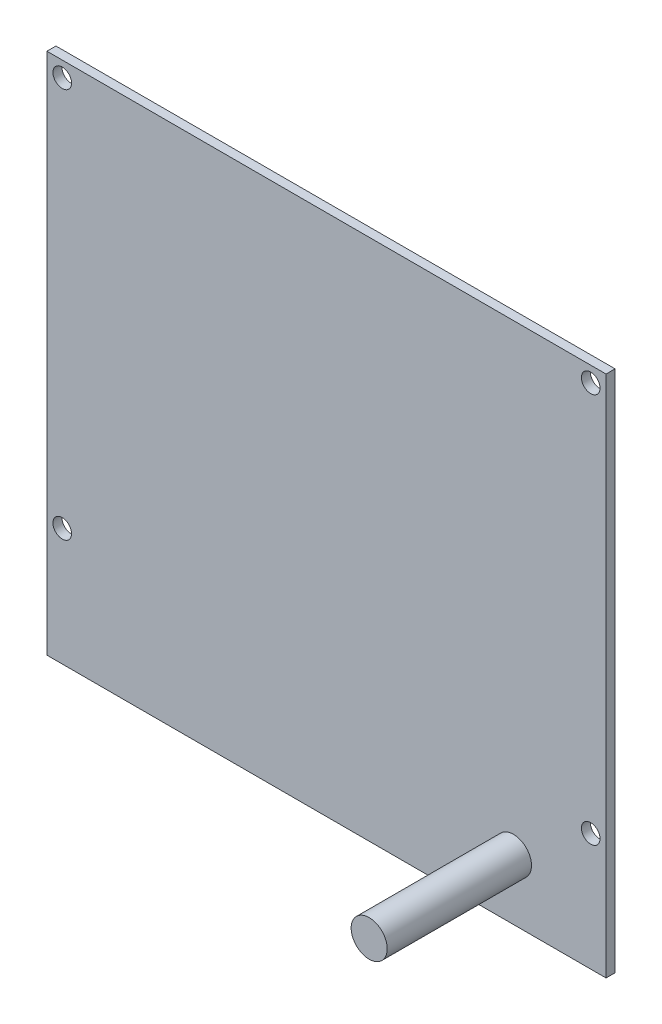
ISO-10303-21;
HEADER;
FILE_DESCRIPTION(('STEP AP214'),'2;1');
FILE_NAME('part.step','',(''),(''),'','','');
FILE_SCHEMA(('AUTOMOTIVE_DESIGN { 1 0 10303 214 1 1 1 1 }'));
ENDSEC;
DATA;
#1=APPLICATION_CONTEXT('core data for automotive mechanical design processes');
#2=APPLICATION_PROTOCOL_DEFINITION('international standard','automotive_design',2000,#1);
#3=PRODUCT_CONTEXT('',#1,'mechanical');
#4=PRODUCT('Part','Part','',(#3));
#5=PRODUCT_RELATED_PRODUCT_CATEGORY('part','',(#4));
#6=PRODUCT_DEFINITION_FORMATION('','',#4);
#7=PRODUCT_DEFINITION_CONTEXT('part definition',#1,'design');
#8=PRODUCT_DEFINITION('design','',#6,#7);
#9=PRODUCT_DEFINITION_SHAPE('','',#8);
#10=(LENGTH_UNIT() NAMED_UNIT(*) SI_UNIT(.MILLI.,.METRE.));
#11=(NAMED_UNIT(*) PLANE_ANGLE_UNIT() SI_UNIT($,.RADIAN.));
#12=(NAMED_UNIT(*) SI_UNIT($,.STERADIAN.) SOLID_ANGLE_UNIT());
#13=UNCERTAINTY_MEASURE_WITH_UNIT(LENGTH_MEASURE(1.E-05),#10,'distance_accuracy_value','');
#14=(GEOMETRIC_REPRESENTATION_CONTEXT(3) GLOBAL_UNCERTAINTY_ASSIGNED_CONTEXT((#13)) GLOBAL_UNIT_ASSIGNED_CONTEXT((#10,
#11,#12)) REPRESENTATION_CONTEXT('',''));
#15=CARTESIAN_POINT('',(0.,0.,0.));
#16=DIRECTION('',(0.,0.,1.));
#17=DIRECTION('',(1.,0.,0.));
#18=AXIS2_PLACEMENT_3D('',#15,#16,#17);
#19=CARTESIAN_POINT('',(46.5,-43.5,1.5));
#20=DIRECTION('',(0.,-1.,0.));
#21=DIRECTION('',(0.,0.,-1.));
#22=AXIS2_PLACEMENT_3D('',#19,#20,#21);
#23=PLANE('',#22);
#24=DIRECTION('',(-1.,0.,0.));
#25=VECTOR('',#24,1.);
#26=CARTESIAN_POINT('',(46.5,-43.5,0.));
#27=LINE('',#26,#25);
#28=CARTESIAN_POINT('',(46.5,-43.5,0.));
#29=VERTEX_POINT('',#28);
#30=CARTESIAN_POINT('',(-46.5,-43.5,0.));
#31=VERTEX_POINT('',#30);
#32=EDGE_CURVE('E105',#29,#31,#27,.T.);
#33=ORIENTED_EDGE('',*,*,#32,.F.);
#34=DIRECTION('',(0.,0.,-1.));
#35=VECTOR('',#34,1.);
#36=CARTESIAN_POINT('',(46.5,-43.5,1.5));
#37=LINE('',#36,#35);
#38=CARTESIAN_POINT('',(46.5,-43.5,1.5));
#39=VERTEX_POINT('',#38);
#40=EDGE_CURVE('E46',#39,#29,#37,.T.);
#41=ORIENTED_EDGE('',*,*,#40,.F.);
#42=DIRECTION('',(-1.,0.,0.));
#43=VECTOR('',#42,1.);
#44=CARTESIAN_POINT('',(46.5,-43.5,1.5));
#45=LINE('',#44,#43);
#46=CARTESIAN_POINT('',(-46.5,-43.5,1.5));
#47=VERTEX_POINT('',#46);
#48=EDGE_CURVE('E98',#39,#47,#45,.T.);
#49=ORIENTED_EDGE('',*,*,#48,.T.);
#50=DIRECTION('',(0.,0.,-1.));
#51=VECTOR('',#50,1.);
#52=CARTESIAN_POINT('',(-46.5,-43.5,1.5));
#53=LINE('',#52,#51);
#54=EDGE_CURVE('E81',#47,#31,#53,.T.);
#55=ORIENTED_EDGE('',*,*,#54,.T.);
#56=EDGE_LOOP('',(#33,#41,#49,#55));
#57=FACE_BOUND('',#56,.T.);
#58=ADVANCED_FACE('F38',(#57),#23,.T.);
#59=CARTESIAN_POINT('',(46.5,43.5,1.5));
#60=DIRECTION('',(1.,0.,0.));
#61=DIRECTION('',(0.,0.,-1.));
#62=AXIS2_PLACEMENT_3D('',#59,#60,#61);
#63=PLANE('',#62);
#64=DIRECTION('',(0.,-1.,0.));
#65=VECTOR('',#64,1.);
#66=CARTESIAN_POINT('',(46.5,43.5,0.));
#67=LINE('',#66,#65);
#68=CARTESIAN_POINT('',(46.5,43.5,0.));
#69=VERTEX_POINT('',#68);
#70=EDGE_CURVE('E100',#69,#29,#67,.T.);
#71=ORIENTED_EDGE('',*,*,#70,.F.);
#72=DIRECTION('',(0.,0.,-1.));
#73=VECTOR('',#72,1.);
#74=CARTESIAN_POINT('',(46.5,43.5,1.5));
#75=LINE('',#74,#73);
#76=CARTESIAN_POINT('',(46.5,43.5,1.5));
#77=VERTEX_POINT('',#76);
#78=EDGE_CURVE('E70',#77,#69,#75,.T.);
#79=ORIENTED_EDGE('',*,*,#78,.F.);
#80=DIRECTION('',(0.,-1.,0.));
#81=VECTOR('',#80,1.);
#82=CARTESIAN_POINT('',(46.5,43.5,1.5));
#83=LINE('',#82,#81);
#84=EDGE_CURVE('E95',#77,#39,#83,.T.);
#85=ORIENTED_EDGE('',*,*,#84,.T.);
#86=ORIENTED_EDGE('',*,*,#40,.T.);
#87=EDGE_LOOP('',(#71,#79,#85,#86));
#88=FACE_BOUND('',#87,.T.);
#89=ADVANCED_FACE('F117',(#88),#63,.T.);
#90=CARTESIAN_POINT('',(-46.5,43.5,1.5));
#91=DIRECTION('',(0.,1.,0.));
#92=DIRECTION('',(0.,0.,1.));
#93=AXIS2_PLACEMENT_3D('',#90,#91,#92);
#94=PLANE('',#93);
#95=DIRECTION('',(1.,0.,0.));
#96=VECTOR('',#95,1.);
#97=CARTESIAN_POINT('',(-46.5,43.5,0.));
#98=LINE('',#97,#96);
#99=CARTESIAN_POINT('',(-46.5,43.5,0.));
#100=VERTEX_POINT('',#99);
#101=EDGE_CURVE('E89',#100,#69,#98,.T.);
#102=ORIENTED_EDGE('',*,*,#101,.F.);
#103=DIRECTION('',(0.,0.,-1.));
#104=VECTOR('',#103,1.);
#105=CARTESIAN_POINT('',(-46.5,43.5,1.5));
#106=LINE('',#105,#104);
#107=CARTESIAN_POINT('',(-46.5,43.5,1.5));
#108=VERTEX_POINT('',#107);
#109=EDGE_CURVE('E84',#108,#100,#106,.T.);
#110=ORIENTED_EDGE('',*,*,#109,.F.);
#111=DIRECTION('',(1.,0.,0.));
#112=VECTOR('',#111,1.);
#113=CARTESIAN_POINT('',(-46.5,43.5,1.5));
#114=LINE('',#113,#112);
#115=EDGE_CURVE('E87',#108,#77,#114,.T.);
#116=ORIENTED_EDGE('',*,*,#115,.T.);
#117=ORIENTED_EDGE('',*,*,#78,.T.);
#118=EDGE_LOOP('',(#102,#110,#116,#117));
#119=FACE_BOUND('',#118,.T.);
#120=ADVANCED_FACE('F86',(#119),#94,.T.);
#121=CARTESIAN_POINT('',(-46.5,-43.5,1.5));
#122=DIRECTION('',(-1.,0.,0.));
#123=DIRECTION('',(0.,0.,1.));
#124=AXIS2_PLACEMENT_3D('',#121,#122,#123);
#125=PLANE('',#124);
#126=DIRECTION('',(0.,1.,0.));
#127=VECTOR('',#126,1.);
#128=CARTESIAN_POINT('',(-46.5,-43.5,0.));
#129=LINE('',#128,#127);
#130=EDGE_CURVE('E108',#31,#100,#129,.T.);
#131=ORIENTED_EDGE('',*,*,#130,.F.);
#132=ORIENTED_EDGE('',*,*,#54,.F.);
#133=DIRECTION('',(0.,1.,0.));
#134=VECTOR('',#133,1.);
#135=CARTESIAN_POINT('',(-46.5,-43.5,1.5));
#136=LINE('',#135,#134);
#137=EDGE_CURVE('E94',#47,#108,#136,.T.);
#138=ORIENTED_EDGE('',*,*,#137,.T.);
#139=ORIENTED_EDGE('',*,*,#109,.T.);
#140=EDGE_LOOP('',(#131,#132,#138,#139));
#141=FACE_BOUND('',#140,.T.);
#142=ADVANCED_FACE('F97',(#141),#125,.T.);
#143=CARTESIAN_POINT('',(0.,0.,1.5));
#144=DIRECTION('',(0.,0.,-1.));
#145=DIRECTION('',(-1.,0.,0.));
#146=AXIS2_PLACEMENT_3D('',#143,#144,#145);
#147=PLANE('',#146);
#148=CARTESIAN_POINT('',(31.1,-33.5,1.5));
#149=DIRECTION('',(0.,0.,-1.));
#150=DIRECTION('',(-1.,0.,0.));
#151=AXIS2_PLACEMENT_3D('',#148,#149,#150);
#152=CIRCLE('',#151,3.);
#153=CARTESIAN_POINT('',(28.1,-33.5,1.5));
#154=VERTEX_POINT('',#153);
#155=EDGE_CURVE('E11',#154,#154,#152,.F.);
#156=ORIENTED_EDGE('',*,*,#155,.F.);
#157=EDGE_LOOP('',(#156));
#158=FACE_BOUND('',#157,.T.);
#159=CARTESIAN_POINT('',(-43.95,-23.95,1.5));
#160=DIRECTION('',(0.,0.,-1.));
#161=DIRECTION('',(-1.,0.,0.));
#162=AXIS2_PLACEMENT_3D('',#159,#160,#161);
#163=CIRCLE('',#162,1.55);
#164=CARTESIAN_POINT('',(-45.5,-23.95,1.5));
#165=VERTEX_POINT('',#164);
#166=EDGE_CURVE('E170',#165,#165,#163,.T.);
#167=ORIENTED_EDGE('',*,*,#166,.T.);
#168=EDGE_LOOP('',(#167));
#169=FACE_BOUND('',#168,.T.);
#170=CARTESIAN_POINT('',(43.95,-23.95,1.5));
#171=DIRECTION('',(0.,0.,-1.));
#172=DIRECTION('',(-1.,0.,0.));
#173=AXIS2_PLACEMENT_3D('',#170,#171,#172);
#174=CIRCLE('',#173,1.55);
#175=CARTESIAN_POINT('',(42.4,-23.95,1.5));
#176=VERTEX_POINT('',#175);
#177=EDGE_CURVE('E178',#176,#176,#174,.T.);
#178=ORIENTED_EDGE('',*,*,#177,.T.);
#179=EDGE_LOOP('',(#178));
#180=FACE_BOUND('',#179,.T.);
#181=CARTESIAN_POINT('',(-43.95,40.95,1.5));
#182=DIRECTION('',(0.,0.,-1.));
#183=DIRECTION('',(-1.,0.,0.));
#184=AXIS2_PLACEMENT_3D('',#181,#182,#183);
#185=CIRCLE('',#184,1.55);
#186=CARTESIAN_POINT('',(-45.5,40.95,1.5));
#187=VERTEX_POINT('',#186);
#188=EDGE_CURVE('E184',#187,#187,#185,.T.);
#189=ORIENTED_EDGE('',*,*,#188,.T.);
#190=EDGE_LOOP('',(#189));
#191=FACE_BOUND('',#190,.T.);
#192=CARTESIAN_POINT('',(43.95,40.95,1.5));
#193=DIRECTION('',(0.,0.,-1.));
#194=DIRECTION('',(-1.,0.,0.));
#195=AXIS2_PLACEMENT_3D('',#192,#193,#194);
#196=CIRCLE('',#195,1.55);
#197=CARTESIAN_POINT('',(42.4,40.95,1.5));
#198=VERTEX_POINT('',#197);
#199=EDGE_CURVE('E109',#198,#198,#196,.T.);
#200=ORIENTED_EDGE('',*,*,#199,.T.);
#201=EDGE_LOOP('',(#200));
#202=FACE_BOUND('',#201,.T.);
#203=ORIENTED_EDGE('',*,*,#48,.F.);
#204=ORIENTED_EDGE('',*,*,#84,.F.);
#205=ORIENTED_EDGE('',*,*,#115,.F.);
#206=ORIENTED_EDGE('',*,*,#137,.F.);
#207=EDGE_LOOP('',(#203,#204,#205,#206));
#208=FACE_BOUND('',#207,.T.);
#209=ADVANCED_FACE('F93',(#158,#169,#180,#191,#202,#208),#147,.F.);
#210=CARTESIAN_POINT('',(0.,0.,0.));
#211=DIRECTION('',(0.,0.,-1.));
#212=DIRECTION('',(-1.,0.,0.));
#213=AXIS2_PLACEMENT_3D('',#210,#211,#212);
#214=PLANE('',#213);
#215=CARTESIAN_POINT('',(-43.95,-23.95,0.));
#216=DIRECTION('',(0.,0.,-1.));
#217=DIRECTION('',(-1.,0.,0.));
#218=AXIS2_PLACEMENT_3D('',#215,#216,#217);
#219=CIRCLE('',#218,1.54999999999999);
#220=CARTESIAN_POINT('',(-45.5,-23.95,0.));
#221=VERTEX_POINT('',#220);
#222=EDGE_CURVE('E167',#221,#221,#219,.T.);
#223=ORIENTED_EDGE('',*,*,#222,.F.);
#224=EDGE_LOOP('',(#223));
#225=FACE_BOUND('',#224,.T.);
#226=CARTESIAN_POINT('',(43.95,-23.95,0.));
#227=DIRECTION('',(0.,0.,-1.));
#228=DIRECTION('',(-1.,0.,0.));
#229=AXIS2_PLACEMENT_3D('',#226,#227,#228);
#230=CIRCLE('',#229,1.54999999999999);
#231=CARTESIAN_POINT('',(42.4,-23.95,0.));
#232=VERTEX_POINT('',#231);
#233=EDGE_CURVE('E175',#232,#232,#230,.T.);
#234=ORIENTED_EDGE('',*,*,#233,.F.);
#235=EDGE_LOOP('',(#234));
#236=FACE_BOUND('',#235,.T.);
#237=CARTESIAN_POINT('',(-43.95,40.95,0.));
#238=DIRECTION('',(0.,0.,-1.));
#239=DIRECTION('',(-1.,0.,0.));
#240=AXIS2_PLACEMENT_3D('',#237,#238,#239);
#241=CIRCLE('',#240,1.54999999999999);
#242=CARTESIAN_POINT('',(-45.5,40.95,0.));
#243=VERTEX_POINT('',#242);
#244=EDGE_CURVE('E181',#243,#243,#241,.T.);
#245=ORIENTED_EDGE('',*,*,#244,.F.);
#246=EDGE_LOOP('',(#245));
#247=FACE_BOUND('',#246,.T.);
#248=CARTESIAN_POINT('',(43.95,40.95,0.));
#249=DIRECTION('',(0.,0.,-1.));
#250=DIRECTION('',(-1.,0.,0.));
#251=AXIS2_PLACEMENT_3D('',#248,#249,#250);
#252=CIRCLE('',#251,1.54999999999999);
#253=CARTESIAN_POINT('',(42.4,40.95,0.));
#254=VERTEX_POINT('',#253);
#255=EDGE_CURVE('E187',#254,#254,#252,.T.);
#256=ORIENTED_EDGE('',*,*,#255,.F.);
#257=EDGE_LOOP('',(#256));
#258=FACE_BOUND('',#257,.T.);
#259=ORIENTED_EDGE('',*,*,#32,.T.);
#260=ORIENTED_EDGE('',*,*,#130,.T.);
#261=ORIENTED_EDGE('',*,*,#101,.T.);
#262=ORIENTED_EDGE('',*,*,#70,.T.);
#263=EDGE_LOOP('',(#259,#260,#261,#262));
#264=FACE_BOUND('',#263,.T.);
#265=ADVANCED_FACE('F116',(#225,#236,#247,#258,#264),#214,.T.);
#266=CARTESIAN_POINT('',(43.95,40.95,0.));
#267=DIRECTION('',(0.,0.,-1.));
#268=DIRECTION('',(-1.,0.,0.));
#269=AXIS2_PLACEMENT_3D('',#266,#267,#268);
#270=CYLINDRICAL_SURFACE('',#269,1.55);
#271=ORIENTED_EDGE('',*,*,#199,.F.);
#272=EDGE_LOOP('',(#271));
#273=FACE_BOUND('',#272,.T.);
#274=ORIENTED_EDGE('',*,*,#255,.T.);
#275=EDGE_LOOP('',(#274));
#276=FACE_BOUND('',#275,.T.);
#277=ADVANCED_FACE('F135',(#273,#276),#270,.F.);
#278=CARTESIAN_POINT('',(-43.95,40.95,0.));
#279=DIRECTION('',(0.,0.,-1.));
#280=DIRECTION('',(-1.,0.,0.));
#281=AXIS2_PLACEMENT_3D('',#278,#279,#280);
#282=CYLINDRICAL_SURFACE('',#281,1.55);
#283=ORIENTED_EDGE('',*,*,#188,.F.);
#284=EDGE_LOOP('',(#283));
#285=FACE_BOUND('',#284,.T.);
#286=ORIENTED_EDGE('',*,*,#244,.T.);
#287=EDGE_LOOP('',(#286));
#288=FACE_BOUND('',#287,.T.);
#289=ADVANCED_FACE('F142',(#285,#288),#282,.F.);
#290=CARTESIAN_POINT('',(43.95,-23.95,0.));
#291=DIRECTION('',(0.,0.,-1.));
#292=DIRECTION('',(-1.,0.,0.));
#293=AXIS2_PLACEMENT_3D('',#290,#291,#292);
#294=CYLINDRICAL_SURFACE('',#293,1.55);
#295=ORIENTED_EDGE('',*,*,#177,.F.);
#296=EDGE_LOOP('',(#295));
#297=FACE_BOUND('',#296,.T.);
#298=ORIENTED_EDGE('',*,*,#233,.T.);
#299=EDGE_LOOP('',(#298));
#300=FACE_BOUND('',#299,.T.);
#301=ADVANCED_FACE('F146',(#297,#300),#294,.F.);
#302=CARTESIAN_POINT('',(-43.95,-23.95,0.));
#303=DIRECTION('',(0.,0.,-1.));
#304=DIRECTION('',(-1.,0.,0.));
#305=AXIS2_PLACEMENT_3D('',#302,#303,#304);
#306=CYLINDRICAL_SURFACE('',#305,1.55);
#307=ORIENTED_EDGE('',*,*,#166,.F.);
#308=EDGE_LOOP('',(#307));
#309=FACE_BOUND('',#308,.T.);
#310=ORIENTED_EDGE('',*,*,#222,.T.);
#311=EDGE_LOOP('',(#310));
#312=FACE_BOUND('',#311,.T.);
#313=ADVANCED_FACE('F150',(#309,#312),#306,.F.);
#314=CARTESIAN_POINT('',(31.1,-33.5,25.5));
#315=DIRECTION('',(0.,0.,-1.));
#316=DIRECTION('',(-1.,0.,0.));
#317=AXIS2_PLACEMENT_3D('',#314,#315,#316);
#318=CYLINDRICAL_SURFACE('',#317,3.);
#319=CARTESIAN_POINT('',(31.1,-33.5,25.5));
#320=DIRECTION('',(0.,0.,1.));
#321=DIRECTION('',(1.,0.,0.));
#322=AXIS2_PLACEMENT_3D('',#319,#320,#321);
#323=CIRCLE('',#322,3.);
#324=CARTESIAN_POINT('',(34.1,-33.5,25.5));
#325=VERTEX_POINT('',#324);
#326=EDGE_CURVE('E166',#325,#325,#323,.T.);
#327=ORIENTED_EDGE('',*,*,#326,.F.);
#328=EDGE_LOOP('',(#327));
#329=FACE_BOUND('',#328,.T.);
#330=ORIENTED_EDGE('',*,*,#155,.T.);
#331=EDGE_LOOP('',(#330));
#332=FACE_BOUND('',#331,.T.);
#333=ADVANCED_FACE('F154',(#329,#332),#318,.T.);
#334=CARTESIAN_POINT('',(31.1,-33.5,25.5));
#335=DIRECTION('',(0.,0.,1.));
#336=DIRECTION('',(1.,0.,0.));
#337=AXIS2_PLACEMENT_3D('',#334,#335,#336);
#338=PLANE('',#337);
#339=ORIENTED_EDGE('',*,*,#326,.T.);
#340=EDGE_LOOP('',(#339));
#341=FACE_BOUND('',#340,.T.);
#342=ADVANCED_FACE('F158',(#341),#338,.T.);
#343=CLOSED_SHELL('',(#58,#89,#120,#142,#209,#265,#277,#289,#301,#313,#333,#342));
#344=MANIFOLD_SOLID_BREP('B2',#343);
#345=ADVANCED_BREP_SHAPE_REPRESENTATION('',(#18,#344),#14);
#346=SHAPE_DEFINITION_REPRESENTATION(#9,#345);
ENDSEC;
END-ISO-10303-21;
